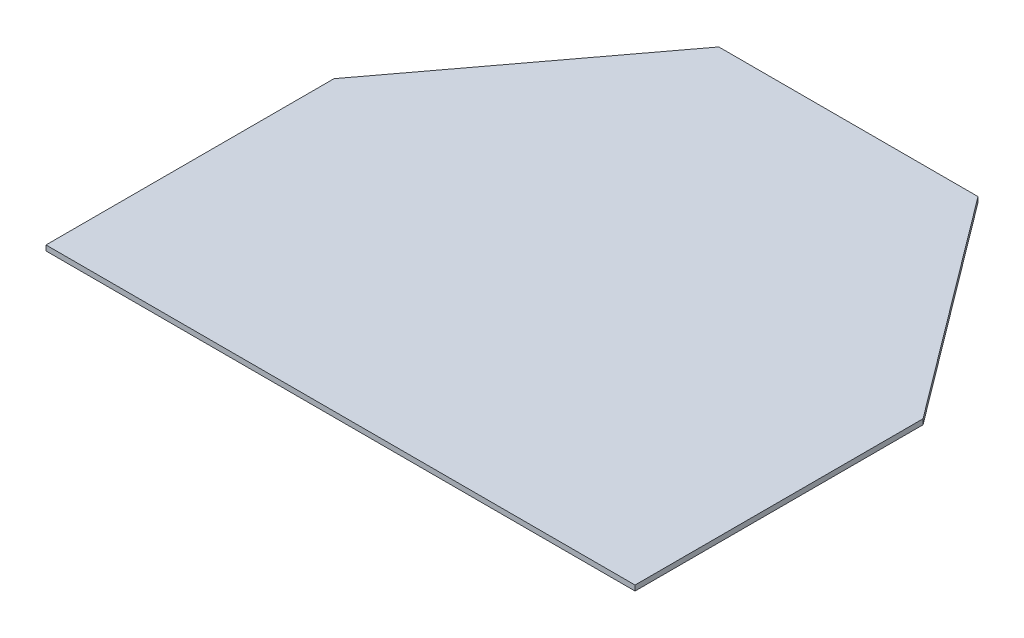
ISO-10303-21;
HEADER;
FILE_DESCRIPTION(('STEP AP214'),'2;1');
FILE_NAME('part.step','',(''),(''),'','','');
FILE_SCHEMA(('AUTOMOTIVE_DESIGN { 1 0 10303 214 1 1 1 1 }'));
ENDSEC;
DATA;
#1=APPLICATION_CONTEXT('core data for automotive mechanical design processes');
#2=APPLICATION_PROTOCOL_DEFINITION('international standard','automotive_design',2000,#1);
#3=PRODUCT_CONTEXT('',#1,'mechanical');
#4=PRODUCT('Part','Part','',(#3));
#5=PRODUCT_RELATED_PRODUCT_CATEGORY('part','',(#4));
#6=PRODUCT_DEFINITION_FORMATION('','',#4);
#7=PRODUCT_DEFINITION_CONTEXT('part definition',#1,'design');
#8=PRODUCT_DEFINITION('design','',#6,#7);
#9=PRODUCT_DEFINITION_SHAPE('','',#8);
#10=(LENGTH_UNIT() NAMED_UNIT(*) SI_UNIT(.MILLI.,.METRE.));
#11=(NAMED_UNIT(*) PLANE_ANGLE_UNIT() SI_UNIT($,.RADIAN.));
#12=(NAMED_UNIT(*) SI_UNIT($,.STERADIAN.) SOLID_ANGLE_UNIT());
#13=UNCERTAINTY_MEASURE_WITH_UNIT(LENGTH_MEASURE(1.E-05),#10,'distance_accuracy_value','');
#14=(GEOMETRIC_REPRESENTATION_CONTEXT(3) GLOBAL_UNCERTAINTY_ASSIGNED_CONTEXT((#13)) GLOBAL_UNIT_ASSIGNED_CONTEXT((#10,
#11,#12)) REPRESENTATION_CONTEXT('',''));
#15=CARTESIAN_POINT('',(0.,0.,0.));
#16=DIRECTION('',(0.,0.,1.));
#17=DIRECTION('',(1.,0.,0.));
#18=AXIS2_PLACEMENT_3D('',#15,#16,#17);
#19=CARTESIAN_POINT('',(-225.,4.,-220.));
#20=DIRECTION('',(0.8,0.,0.6));
#21=DIRECTION('',(0.6,0.,-0.8));
#22=AXIS2_PLACEMENT_3D('',#19,#20,#21);
#23=PLANE('',#22);
#24=DIRECTION('',(-0.6,0.,0.8));
#25=VECTOR('',#24,1.);
#26=CARTESIAN_POINT('',(-225.,0.,-220.));
#27=LINE('',#26,#25);
#28=CARTESIAN_POINT('',(-99.,0.,-388.));
#29=VERTEX_POINT('',#28);
#30=CARTESIAN_POINT('',(-225.,0.,-220.));
#31=VERTEX_POINT('',#30);
#32=EDGE_CURVE('E128',#29,#31,#27,.T.);
#33=ORIENTED_EDGE('',*,*,#32,.T.);
#34=DIRECTION('',(0.,-1.,0.));
#35=VECTOR('',#34,1.);
#36=CARTESIAN_POINT('',(-225.,4.,-220.));
#37=LINE('',#36,#35);
#38=CARTESIAN_POINT('',(-225.,4.,-220.));
#39=VERTEX_POINT('',#38);
#40=EDGE_CURVE('E11',#39,#31,#37,.T.);
#41=ORIENTED_EDGE('',*,*,#40,.F.);
#42=DIRECTION('',(-0.6,0.,0.8));
#43=VECTOR('',#42,1.);
#44=CARTESIAN_POINT('',(-225.,4.,-220.));
#45=LINE('',#44,#43);
#46=CARTESIAN_POINT('',(-99.,4.,-388.));
#47=VERTEX_POINT('',#46);
#48=EDGE_CURVE('E144',#47,#39,#45,.T.);
#49=ORIENTED_EDGE('',*,*,#48,.F.);
#50=DIRECTION('',(0.,-1.,0.));
#51=VECTOR('',#50,1.);
#52=CARTESIAN_POINT('',(-99.,4.,-388.));
#53=LINE('',#52,#51);
#54=EDGE_CURVE('E124',#47,#29,#53,.T.);
#55=ORIENTED_EDGE('',*,*,#54,.T.);
#56=EDGE_LOOP('',(#33,#41,#49,#55));
#57=FACE_BOUND('',#56,.T.);
#58=ADVANCED_FACE('F39',(#57),#23,.F.);
#59=CARTESIAN_POINT('',(-225.,4.,0.));
#60=DIRECTION('',(1.,0.,0.));
#61=DIRECTION('',(0.,0.,-1.));
#62=AXIS2_PLACEMENT_3D('',#59,#60,#61);
#63=PLANE('',#62);
#64=DIRECTION('',(0.,0.,1.));
#65=VECTOR('',#64,1.);
#66=CARTESIAN_POINT('',(-225.,0.,0.));
#67=LINE('',#66,#65);
#68=CARTESIAN_POINT('',(-225.,0.,0.));
#69=VERTEX_POINT('',#68);
#70=EDGE_CURVE('E132',#31,#69,#67,.T.);
#71=ORIENTED_EDGE('',*,*,#70,.T.);
#72=DIRECTION('',(0.,-1.,0.));
#73=VECTOR('',#72,1.);
#74=CARTESIAN_POINT('',(-225.,4.,0.));
#75=LINE('',#74,#73);
#76=CARTESIAN_POINT('',(-225.,4.,0.));
#77=VERTEX_POINT('',#76);
#78=EDGE_CURVE('E48',#77,#69,#75,.T.);
#79=ORIENTED_EDGE('',*,*,#78,.F.);
#80=DIRECTION('',(0.,0.,1.));
#81=VECTOR('',#80,1.);
#82=CARTESIAN_POINT('',(-225.,4.,0.));
#83=LINE('',#82,#81);
#84=EDGE_CURVE('E93',#39,#77,#83,.T.);
#85=ORIENTED_EDGE('',*,*,#84,.F.);
#86=ORIENTED_EDGE('',*,*,#40,.T.);
#87=EDGE_LOOP('',(#71,#79,#85,#86));
#88=FACE_BOUND('',#87,.T.);
#89=ADVANCED_FACE('F172',(#88),#63,.F.);
#90=CARTESIAN_POINT('',(-225.,4.,0.));
#91=DIRECTION('',(0.,0.,-1.));
#92=DIRECTION('',(-1.,0.,0.));
#93=AXIS2_PLACEMENT_3D('',#90,#91,#92);
#94=PLANE('',#93);
#95=DIRECTION('',(1.,0.,0.));
#96=VECTOR('',#95,1.);
#97=CARTESIAN_POINT('',(-225.,0.,0.));
#98=LINE('',#97,#96);
#99=CARTESIAN_POINT('',(225.,0.,0.));
#100=VERTEX_POINT('',#99);
#101=EDGE_CURVE('E135',#69,#100,#98,.T.);
#102=ORIENTED_EDGE('',*,*,#101,.T.);
#103=DIRECTION('',(0.,-1.,0.));
#104=VECTOR('',#103,1.);
#105=CARTESIAN_POINT('',(225.,4.,0.));
#106=LINE('',#105,#104);
#107=CARTESIAN_POINT('',(225.,4.,0.));
#108=VERTEX_POINT('',#107);
#109=EDGE_CURVE('E117',#108,#100,#106,.T.);
#110=ORIENTED_EDGE('',*,*,#109,.F.);
#111=DIRECTION('',(1.,0.,0.));
#112=VECTOR('',#111,1.);
#113=CARTESIAN_POINT('',(-225.,4.,0.));
#114=LINE('',#113,#112);
#115=EDGE_CURVE('E106',#77,#108,#114,.T.);
#116=ORIENTED_EDGE('',*,*,#115,.F.);
#117=ORIENTED_EDGE('',*,*,#78,.T.);
#118=EDGE_LOOP('',(#102,#110,#116,#117));
#119=FACE_BOUND('',#118,.T.);
#120=ADVANCED_FACE('F154',(#119),#94,.F.);
#121=CARTESIAN_POINT('',(225.,4.,0.));
#122=DIRECTION('',(-1.,0.,0.));
#123=DIRECTION('',(0.,0.,1.));
#124=AXIS2_PLACEMENT_3D('',#121,#122,#123);
#125=PLANE('',#124);
#126=DIRECTION('',(0.,0.,-1.));
#127=VECTOR('',#126,1.);
#128=CARTESIAN_POINT('',(225.,0.,0.));
#129=LINE('',#128,#127);
#130=CARTESIAN_POINT('',(225.,0.,-220.));
#131=VERTEX_POINT('',#130);
#132=EDGE_CURVE('E115',#100,#131,#129,.T.);
#133=ORIENTED_EDGE('',*,*,#132,.T.);
#134=DIRECTION('',(0.,-1.,0.));
#135=VECTOR('',#134,1.);
#136=CARTESIAN_POINT('',(225.,4.,-220.));
#137=LINE('',#136,#135);
#138=CARTESIAN_POINT('',(225.,4.,-220.));
#139=VERTEX_POINT('',#138);
#140=EDGE_CURVE('E112',#139,#131,#137,.T.);
#141=ORIENTED_EDGE('',*,*,#140,.F.);
#142=DIRECTION('',(0.,0.,-1.));
#143=VECTOR('',#142,1.);
#144=CARTESIAN_POINT('',(225.,4.,0.));
#145=LINE('',#144,#143);
#146=EDGE_CURVE('E100',#108,#139,#145,.T.);
#147=ORIENTED_EDGE('',*,*,#146,.F.);
#148=ORIENTED_EDGE('',*,*,#109,.T.);
#149=EDGE_LOOP('',(#133,#141,#147,#148));
#150=FACE_BOUND('',#149,.T.);
#151=ADVANCED_FACE('F113',(#150),#125,.F.);
#152=CARTESIAN_POINT('',(225.,4.,-220.));
#153=DIRECTION('',(-0.8,0.,0.6));
#154=DIRECTION('',(0.6,0.,0.8));
#155=AXIS2_PLACEMENT_3D('',#152,#153,#154);
#156=PLANE('',#155);
#157=DIRECTION('',(-0.6,0.,-0.8));
#158=VECTOR('',#157,1.);
#159=CARTESIAN_POINT('',(225.,0.,-220.));
#160=LINE('',#159,#158);
#161=CARTESIAN_POINT('',(99.,0.,-388.));
#162=VERTEX_POINT('',#161);
#163=EDGE_CURVE('E79',#131,#162,#160,.T.);
#164=ORIENTED_EDGE('',*,*,#163,.T.);
#165=DIRECTION('',(0.,-1.,0.));
#166=VECTOR('',#165,1.);
#167=CARTESIAN_POINT('',(99.,4.,-388.));
#168=LINE('',#167,#166);
#169=CARTESIAN_POINT('',(99.,4.,-388.));
#170=VERTEX_POINT('',#169);
#171=EDGE_CURVE('E118',#170,#162,#168,.T.);
#172=ORIENTED_EDGE('',*,*,#171,.F.);
#173=DIRECTION('',(-0.6,0.,-0.8));
#174=VECTOR('',#173,1.);
#175=CARTESIAN_POINT('',(225.,4.,-220.));
#176=LINE('',#175,#174);
#177=EDGE_CURVE('E104',#139,#170,#176,.T.);
#178=ORIENTED_EDGE('',*,*,#177,.F.);
#179=ORIENTED_EDGE('',*,*,#140,.T.);
#180=EDGE_LOOP('',(#164,#172,#178,#179));
#181=FACE_BOUND('',#180,.T.);
#182=ADVANCED_FACE('F120',(#181),#156,.F.);
#183=CARTESIAN_POINT('',(99.,4.,-388.));
#184=DIRECTION('',(0.,0.,1.));
#185=DIRECTION('',(1.,0.,0.));
#186=AXIS2_PLACEMENT_3D('',#183,#184,#185);
#187=PLANE('',#186);
#188=DIRECTION('',(-1.,0.,0.));
#189=VECTOR('',#188,1.);
#190=CARTESIAN_POINT('',(99.,0.,-388.));
#191=LINE('',#190,#189);
#192=EDGE_CURVE('E85',#162,#29,#191,.T.);
#193=ORIENTED_EDGE('',*,*,#192,.T.);
#194=ORIENTED_EDGE('',*,*,#54,.F.);
#195=DIRECTION('',(-1.,0.,0.));
#196=VECTOR('',#195,1.);
#197=CARTESIAN_POINT('',(99.,4.,-388.));
#198=LINE('',#197,#196);
#199=EDGE_CURVE('E56',#170,#47,#198,.T.);
#200=ORIENTED_EDGE('',*,*,#199,.F.);
#201=ORIENTED_EDGE('',*,*,#171,.T.);
#202=EDGE_LOOP('',(#193,#194,#200,#201));
#203=FACE_BOUND('',#202,.T.);
#204=ADVANCED_FACE('F161',(#203),#187,.F.);
#205=CARTESIAN_POINT('',(0.,4.,0.));
#206=DIRECTION('',(0.,1.,0.));
#207=DIRECTION('',(0.,0.,1.));
#208=AXIS2_PLACEMENT_3D('',#205,#206,#207);
#209=PLANE('',#208);
#210=ORIENTED_EDGE('',*,*,#48,.T.);
#211=ORIENTED_EDGE('',*,*,#84,.T.);
#212=ORIENTED_EDGE('',*,*,#115,.T.);
#213=ORIENTED_EDGE('',*,*,#146,.T.);
#214=ORIENTED_EDGE('',*,*,#177,.T.);
#215=ORIENTED_EDGE('',*,*,#199,.T.);
#216=EDGE_LOOP('',(#210,#211,#212,#213,#214,#215));
#217=FACE_BOUND('',#216,.T.);
#218=ADVANCED_FACE('F102',(#217),#209,.T.);
#219=CARTESIAN_POINT('',(0.,0.,0.));
#220=DIRECTION('',(0.,1.,0.));
#221=DIRECTION('',(0.,0.,1.));
#222=AXIS2_PLACEMENT_3D('',#219,#220,#221);
#223=PLANE('',#222);
#224=ORIENTED_EDGE('',*,*,#32,.F.);
#225=ORIENTED_EDGE('',*,*,#192,.F.);
#226=ORIENTED_EDGE('',*,*,#163,.F.);
#227=ORIENTED_EDGE('',*,*,#132,.F.);
#228=ORIENTED_EDGE('',*,*,#101,.F.);
#229=ORIENTED_EDGE('',*,*,#70,.F.);
#230=EDGE_LOOP('',(#224,#225,#226,#227,#228,#229));
#231=FACE_BOUND('',#230,.T.);
#232=ADVANCED_FACE('F157',(#231),#223,.F.);
#233=CLOSED_SHELL('',(#58,#89,#120,#151,#182,#204,#218,#232));
#234=MANIFOLD_SOLID_BREP('B2',#233);
#235=ADVANCED_BREP_SHAPE_REPRESENTATION('',(#18,#234),#14);
#236=SHAPE_DEFINITION_REPRESENTATION(#9,#235);
ENDSEC;
END-ISO-10303-21;
